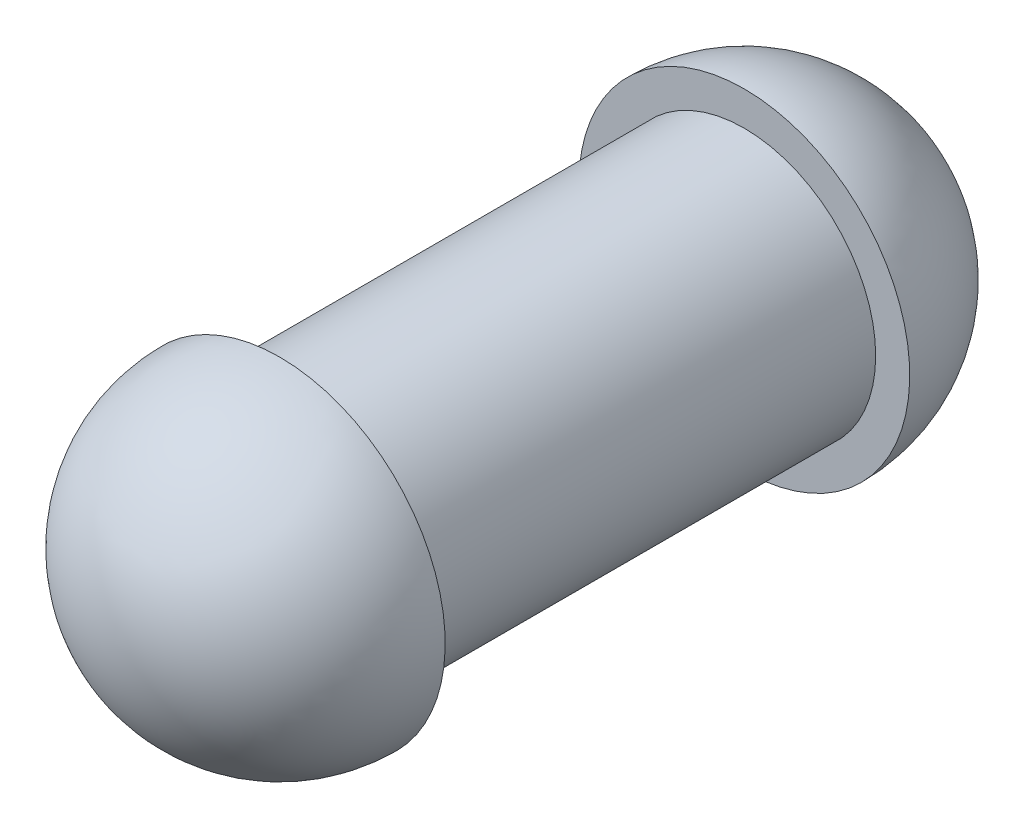
ISO-10303-21;
HEADER;
FILE_DESCRIPTION(('STEP AP214'),'2;1');
FILE_NAME('part.step','',(''),(''),'','','');
FILE_SCHEMA(('AUTOMOTIVE_DESIGN { 1 0 10303 214 1 1 1 1 }'));
ENDSEC;
DATA;
#1=APPLICATION_CONTEXT('core data for automotive mechanical design processes');
#2=APPLICATION_PROTOCOL_DEFINITION('international standard','automotive_design',2000,#1);
#3=PRODUCT_CONTEXT('',#1,'mechanical');
#4=PRODUCT('Part','Part','',(#3));
#5=PRODUCT_RELATED_PRODUCT_CATEGORY('part','',(#4));
#6=PRODUCT_DEFINITION_FORMATION('','',#4);
#7=PRODUCT_DEFINITION_CONTEXT('part definition',#1,'design');
#8=PRODUCT_DEFINITION('design','',#6,#7);
#9=PRODUCT_DEFINITION_SHAPE('','',#8);
#10=(LENGTH_UNIT() NAMED_UNIT(*) SI_UNIT(.MILLI.,.METRE.));
#11=(NAMED_UNIT(*) PLANE_ANGLE_UNIT() SI_UNIT($,.RADIAN.));
#12=(NAMED_UNIT(*) SI_UNIT($,.STERADIAN.) SOLID_ANGLE_UNIT());
#13=UNCERTAINTY_MEASURE_WITH_UNIT(LENGTH_MEASURE(1.E-05),#10,'distance_accuracy_value','');
#14=(GEOMETRIC_REPRESENTATION_CONTEXT(3) GLOBAL_UNCERTAINTY_ASSIGNED_CONTEXT((#13)) GLOBAL_UNIT_ASSIGNED_CONTEXT((#10,
#11,#12)) REPRESENTATION_CONTEXT('',''));
#15=CARTESIAN_POINT('',(0.,0.,0.));
#16=DIRECTION('',(0.,0.,1.));
#17=DIRECTION('',(1.,0.,0.));
#18=AXIS2_PLACEMENT_3D('',#15,#16,#17);
#19=CARTESIAN_POINT('',(0.,0.,36.5));
#20=DIRECTION('',(0.,0.,-1.));
#21=DIRECTION('',(-1.,0.,0.));
#22=AXIS2_PLACEMENT_3D('',#19,#20,#21);
#23=CYLINDRICAL_SURFACE('',#22,20.65);
#24=CARTESIAN_POINT('',(0.,0.,36.5));
#25=DIRECTION('',(0.,0.,1.));
#26=DIRECTION('',(1.,0.,0.));
#27=AXIS2_PLACEMENT_3D('',#24,#25,#26);
#28=CIRCLE('',#27,20.65);
#29=CARTESIAN_POINT('',(20.65,0.,36.5));
#30=VERTEX_POINT('',#29);
#31=EDGE_CURVE('E10',#30,#30,#28,.T.);
#32=ORIENTED_EDGE('',*,*,#31,.F.);
#33=EDGE_LOOP('',(#32));
#34=FACE_BOUND('',#33,.T.);
#35=CARTESIAN_POINT('',(0.,0.,-36.5));
#36=DIRECTION('',(0.,0.,1.));
#37=DIRECTION('',(1.,0.,0.));
#38=AXIS2_PLACEMENT_3D('',#35,#36,#37);
#39=CIRCLE('',#38,20.65);
#40=CARTESIAN_POINT('',(20.65,0.,-36.5));
#41=VERTEX_POINT('',#40);
#42=EDGE_CURVE('E49',#41,#41,#39,.T.);
#43=ORIENTED_EDGE('',*,*,#42,.T.);
#44=EDGE_LOOP('',(#43));
#45=FACE_BOUND('',#44,.T.);
#46=ADVANCED_FACE('F37',(#34,#45),#23,.T.);
#47=CARTESIAN_POINT('',(0.,0.,36.5));
#48=DIRECTION('',(0.,0.,-1.));
#49=DIRECTION('',(-1.,0.,0.));
#50=AXIS2_PLACEMENT_3D('',#47,#48,#49);
#51=PLANE('',#50);
#52=ORIENTED_EDGE('',*,*,#31,.T.);
#53=EDGE_LOOP('',(#52));
#54=FACE_BOUND('',#53,.T.);
#55=CARTESIAN_POINT('',(0.,0.,36.5));
#56=DIRECTION('',(0.,0.,-1.));
#57=DIRECTION('',(-1.,0.,0.));
#58=AXIS2_PLACEMENT_3D('',#55,#56,#57);
#59=CIRCLE('',#58,26.);
#60=CARTESIAN_POINT('',(-26.,0.,36.5));
#61=VERTEX_POINT('',#60);
#62=EDGE_CURVE('E44',#61,#61,#59,.T.);
#63=ORIENTED_EDGE('',*,*,#62,.T.);
#64=EDGE_LOOP('',(#63));
#65=FACE_BOUND('',#64,.T.);
#66=ADVANCED_FACE('F73',(#54,#65),#51,.T.);
#67=CARTESIAN_POINT('',(0.,0.,36.5));
#68=DIRECTION('',(0.,0.,-1.));
#69=DIRECTION('',(0.,1.,0.));
#70=AXIS2_PLACEMENT_3D('',#67,#68,#69);
#71=SPHERICAL_SURFACE('',#70,26.);
#72=ORIENTED_EDGE('',*,*,#62,.F.);
#73=EDGE_LOOP('',(#72));
#74=FACE_BOUND('',#73,.T.);
#75=ADVANCED_FACE('F65',(#74),#71,.T.);
#76=CARTESIAN_POINT('',(0.,0.,-36.5));
#77=DIRECTION('',(0.,0.,1.));
#78=DIRECTION('',(-1.,0.,0.));
#79=AXIS2_PLACEMENT_3D('',#76,#77,#78);
#80=PLANE('',#79);
#81=ORIENTED_EDGE('',*,*,#42,.F.);
#82=EDGE_LOOP('',(#81));
#83=FACE_BOUND('',#82,.T.);
#84=CARTESIAN_POINT('',(0.,0.,-36.5));
#85=DIRECTION('',(0.,0.,-1.));
#86=DIRECTION('',(-1.,0.,0.));
#87=AXIS2_PLACEMENT_3D('',#84,#85,#86);
#88=CIRCLE('',#87,26.);
#89=CARTESIAN_POINT('',(-26.,0.,-36.5));
#90=VERTEX_POINT('',#89);
#91=EDGE_CURVE('E54',#90,#90,#88,.T.);
#92=ORIENTED_EDGE('',*,*,#91,.F.);
#93=EDGE_LOOP('',(#92));
#94=FACE_BOUND('',#93,.T.);
#95=ADVANCED_FACE('F63',(#83,#94),#80,.T.);
#96=CARTESIAN_POINT('',(0.,0.,-36.5));
#97=DIRECTION('',(0.,0.,1.));
#98=DIRECTION('',(0.,1.,0.));
#99=AXIS2_PLACEMENT_3D('',#96,#97,#98);
#100=SPHERICAL_SURFACE('',#99,26.);
#101=ORIENTED_EDGE('',*,*,#91,.T.);
#102=EDGE_LOOP('',(#101));
#103=FACE_BOUND('',#102,.T.);
#104=ADVANCED_FACE('F61',(#103),#100,.T.);
#105=CLOSED_SHELL('',(#46,#66,#75,#95,#104));
#106=MANIFOLD_SOLID_BREP('B2',#105);
#107=ADVANCED_BREP_SHAPE_REPRESENTATION('',(#18,#106),#14);
#108=SHAPE_DEFINITION_REPRESENTATION(#9,#107);
ENDSEC;
END-ISO-10303-21;
